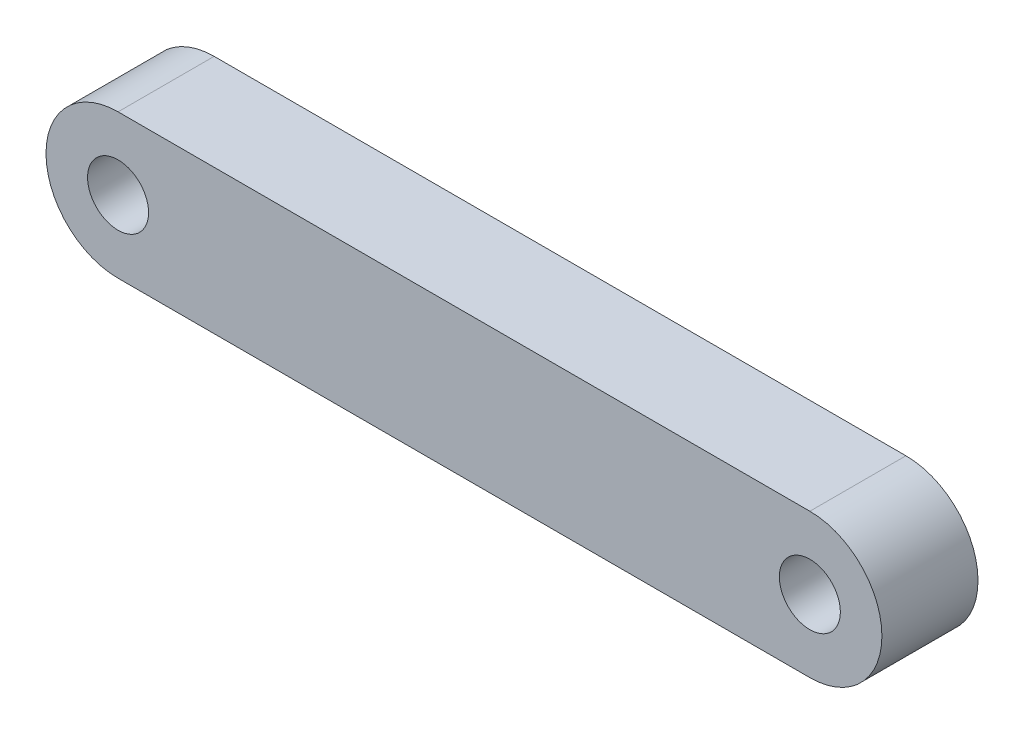
ISO-10303-21;
HEADER;
FILE_DESCRIPTION(('STEP AP214'),'2;1');
FILE_NAME('part.step','',(''),(''),'','','');
FILE_SCHEMA(('AUTOMOTIVE_DESIGN { 1 0 10303 214 1 1 1 1 }'));
ENDSEC;
DATA;
#1=APPLICATION_CONTEXT('core data for automotive mechanical design processes');
#2=APPLICATION_PROTOCOL_DEFINITION('international standard','automotive_design',2000,#1);
#3=PRODUCT_CONTEXT('',#1,'mechanical');
#4=PRODUCT('Part','Part','',(#3));
#5=PRODUCT_RELATED_PRODUCT_CATEGORY('part','',(#4));
#6=PRODUCT_DEFINITION_FORMATION('','',#4);
#7=PRODUCT_DEFINITION_CONTEXT('part definition',#1,'design');
#8=PRODUCT_DEFINITION('design','',#6,#7);
#9=PRODUCT_DEFINITION_SHAPE('','',#8);
#10=(LENGTH_UNIT() NAMED_UNIT(*) SI_UNIT(.MILLI.,.METRE.));
#11=(NAMED_UNIT(*) PLANE_ANGLE_UNIT() SI_UNIT($,.RADIAN.));
#12=(NAMED_UNIT(*) SI_UNIT($,.STERADIAN.) SOLID_ANGLE_UNIT());
#13=UNCERTAINTY_MEASURE_WITH_UNIT(LENGTH_MEASURE(1.E-05),#10,'distance_accuracy_value','');
#14=(GEOMETRIC_REPRESENTATION_CONTEXT(3) GLOBAL_UNCERTAINTY_ASSIGNED_CONTEXT((#13)) GLOBAL_UNIT_ASSIGNED_CONTEXT((#10,
#11,#12)) REPRESENTATION_CONTEXT('',''));
#15=CARTESIAN_POINT('',(0.,0.,0.));
#16=DIRECTION('',(0.,0.,1.));
#17=DIRECTION('',(1.,0.,0.));
#18=AXIS2_PLACEMENT_3D('',#15,#16,#17);
#19=CARTESIAN_POINT('',(-18.,0.,2.5));
#20=DIRECTION('',(0.,0.,-1.));
#21=DIRECTION('',(-1.,0.,0.));
#22=AXIS2_PLACEMENT_3D('',#19,#20,#21);
#23=CYLINDRICAL_SURFACE('',#22,3.75);
#24=CARTESIAN_POINT('',(-18.,0.,-2.5));
#25=DIRECTION('',(0.,0.,1.));
#26=DIRECTION('',(1.,0.,0.));
#27=AXIS2_PLACEMENT_3D('',#24,#25,#26);
#28=CIRCLE('',#27,3.75);
#29=CARTESIAN_POINT('',(-18.,3.75,-2.5));
#30=VERTEX_POINT('',#29);
#31=CARTESIAN_POINT('',(-18.,-3.75,-2.5));
#32=VERTEX_POINT('',#31);
#33=EDGE_CURVE('E97',#30,#32,#28,.T.);
#34=ORIENTED_EDGE('',*,*,#33,.T.);
#35=DIRECTION('',(0.,0.,-1.));
#36=VECTOR('',#35,1.);
#37=CARTESIAN_POINT('',(-18.,-3.75,2.5));
#38=LINE('',#37,#36);
#39=CARTESIAN_POINT('',(-18.,-3.75,2.5));
#40=VERTEX_POINT('',#39);
#41=EDGE_CURVE('E11',#40,#32,#38,.T.);
#42=ORIENTED_EDGE('',*,*,#41,.F.);
#43=CARTESIAN_POINT('',(-18.,0.,2.5));
#44=DIRECTION('',(0.,0.,1.));
#45=DIRECTION('',(1.,0.,0.));
#46=AXIS2_PLACEMENT_3D('',#43,#44,#45);
#47=CIRCLE('',#46,3.75);
#48=CARTESIAN_POINT('',(-18.,3.75,2.5));
#49=VERTEX_POINT('',#48);
#50=EDGE_CURVE('E85',#49,#40,#47,.T.);
#51=ORIENTED_EDGE('',*,*,#50,.F.);
#52=DIRECTION('',(0.,0.,-1.));
#53=VECTOR('',#52,1.);
#54=CARTESIAN_POINT('',(-18.,3.75,2.5));
#55=LINE('',#54,#53);
#56=EDGE_CURVE('E93',#49,#30,#55,.T.);
#57=ORIENTED_EDGE('',*,*,#56,.T.);
#58=EDGE_LOOP('',(#34,#42,#51,#57));
#59=FACE_BOUND('',#58,.T.);
#60=ADVANCED_FACE('F34',(#59),#23,.T.);
#61=CARTESIAN_POINT('',(-18.,-3.75,2.5));
#62=DIRECTION('',(0.,1.,0.));
#63=DIRECTION('',(0.,0.,1.));
#64=AXIS2_PLACEMENT_3D('',#61,#62,#63);
#65=PLANE('',#64);
#66=DIRECTION('',(1.,0.,0.));
#67=VECTOR('',#66,1.);
#68=CARTESIAN_POINT('',(-18.,-3.75,-2.5));
#69=LINE('',#68,#67);
#70=CARTESIAN_POINT('',(18.,-3.75,-2.5));
#71=VERTEX_POINT('',#70);
#72=EDGE_CURVE('E89',#32,#71,#69,.T.);
#73=ORIENTED_EDGE('',*,*,#72,.T.);
#74=DIRECTION('',(0.,0.,-1.));
#75=VECTOR('',#74,1.);
#76=CARTESIAN_POINT('',(18.,-3.75,2.5));
#77=LINE('',#76,#75);
#78=CARTESIAN_POINT('',(18.,-3.75,2.5));
#79=VERTEX_POINT('',#78);
#80=EDGE_CURVE('E42',#79,#71,#77,.T.);
#81=ORIENTED_EDGE('',*,*,#80,.F.);
#82=DIRECTION('',(1.,0.,0.));
#83=VECTOR('',#82,1.);
#84=CARTESIAN_POINT('',(-18.,-3.75,2.5));
#85=LINE('',#84,#83);
#86=EDGE_CURVE('E80',#40,#79,#85,.T.);
#87=ORIENTED_EDGE('',*,*,#86,.F.);
#88=ORIENTED_EDGE('',*,*,#41,.T.);
#89=EDGE_LOOP('',(#73,#81,#87,#88));
#90=FACE_BOUND('',#89,.T.);
#91=ADVANCED_FACE('F88',(#90),#65,.F.);
#92=CARTESIAN_POINT('',(18.,0.,2.5));
#93=DIRECTION('',(0.,0.,-1.));
#94=DIRECTION('',(-1.,0.,0.));
#95=AXIS2_PLACEMENT_3D('',#92,#93,#94);
#96=CYLINDRICAL_SURFACE('',#95,3.75);
#97=CARTESIAN_POINT('',(18.,0.,-2.5));
#98=DIRECTION('',(0.,0.,1.));
#99=DIRECTION('',(1.,0.,0.));
#100=AXIS2_PLACEMENT_3D('',#97,#98,#99);
#101=CIRCLE('',#100,3.75);
#102=CARTESIAN_POINT('',(18.,3.75000000000001,-2.5));
#103=VERTEX_POINT('',#102);
#104=EDGE_CURVE('E67',#71,#103,#101,.T.);
#105=ORIENTED_EDGE('',*,*,#104,.T.);
#106=DIRECTION('',(0.,0.,-1.));
#107=VECTOR('',#106,1.);
#108=CARTESIAN_POINT('',(18.,3.75000000000001,2.5));
#109=LINE('',#108,#107);
#110=CARTESIAN_POINT('',(18.,3.75000000000001,2.5));
#111=VERTEX_POINT('',#110);
#112=EDGE_CURVE('E90',#111,#103,#109,.T.);
#113=ORIENTED_EDGE('',*,*,#112,.F.);
#114=CARTESIAN_POINT('',(18.,0.,2.5));
#115=DIRECTION('',(0.,0.,1.));
#116=DIRECTION('',(1.,0.,0.));
#117=AXIS2_PLACEMENT_3D('',#114,#115,#116);
#118=CIRCLE('',#117,3.75);
#119=EDGE_CURVE('E83',#79,#111,#118,.T.);
#120=ORIENTED_EDGE('',*,*,#119,.F.);
#121=ORIENTED_EDGE('',*,*,#80,.T.);
#122=EDGE_LOOP('',(#105,#113,#120,#121));
#123=FACE_BOUND('',#122,.T.);
#124=ADVANCED_FACE('F91',(#123),#96,.T.);
#125=CARTESIAN_POINT('',(-18.,3.75,2.5));
#126=DIRECTION('',(0.,-1.,0.));
#127=DIRECTION('',(1.,0.,0.));
#128=AXIS2_PLACEMENT_3D('',#125,#126,#127);
#129=PLANE('',#128);
#130=DIRECTION('',(-1.,0.,0.));
#131=VECTOR('',#130,1.);
#132=CARTESIAN_POINT('',(-18.,3.75,-2.5));
#133=LINE('',#132,#131);
#134=EDGE_CURVE('E73',#103,#30,#133,.T.);
#135=ORIENTED_EDGE('',*,*,#134,.T.);
#136=ORIENTED_EDGE('',*,*,#56,.F.);
#137=DIRECTION('',(-1.,0.,0.));
#138=VECTOR('',#137,1.);
#139=CARTESIAN_POINT('',(-18.,3.75,2.5));
#140=LINE('',#139,#138);
#141=EDGE_CURVE('E50',#111,#49,#140,.T.);
#142=ORIENTED_EDGE('',*,*,#141,.F.);
#143=ORIENTED_EDGE('',*,*,#112,.T.);
#144=EDGE_LOOP('',(#135,#136,#142,#143));
#145=FACE_BOUND('',#144,.T.);
#146=ADVANCED_FACE('F105',(#145),#129,.F.);
#147=CARTESIAN_POINT('',(-18.,0.,2.5));
#148=DIRECTION('',(0.,0.,1.));
#149=DIRECTION('',(1.,0.,0.));
#150=AXIS2_PLACEMENT_3D('',#147,#148,#149);
#151=PLANE('',#150);
#152=CARTESIAN_POINT('',(-18.,0.,2.5));
#153=DIRECTION('',(0.,0.,1.));
#154=DIRECTION('',(1.,0.,0.));
#155=AXIS2_PLACEMENT_3D('',#152,#153,#154);
#156=CIRCLE('',#155,1.5875);
#157=CARTESIAN_POINT('',(-16.4125,0.,2.5));
#158=VERTEX_POINT('',#157);
#159=EDGE_CURVE('E117',#158,#158,#156,.T.);
#160=ORIENTED_EDGE('',*,*,#159,.F.);
#161=EDGE_LOOP('',(#160));
#162=FACE_BOUND('',#161,.T.);
#163=CARTESIAN_POINT('',(18.,0.,2.5));
#164=DIRECTION('',(0.,0.,1.));
#165=DIRECTION('',(1.,0.,0.));
#166=AXIS2_PLACEMENT_3D('',#163,#164,#165);
#167=CIRCLE('',#166,1.5875);
#168=CARTESIAN_POINT('',(19.5875,0.,2.5));
#169=VERTEX_POINT('',#168);
#170=EDGE_CURVE('E111',#169,#169,#167,.T.);
#171=ORIENTED_EDGE('',*,*,#170,.F.);
#172=EDGE_LOOP('',(#171));
#173=FACE_BOUND('',#172,.T.);
#174=ORIENTED_EDGE('',*,*,#50,.T.);
#175=ORIENTED_EDGE('',*,*,#86,.T.);
#176=ORIENTED_EDGE('',*,*,#119,.T.);
#177=ORIENTED_EDGE('',*,*,#141,.T.);
#178=EDGE_LOOP('',(#174,#175,#176,#177));
#179=FACE_BOUND('',#178,.T.);
#180=ADVANCED_FACE('F81',(#162,#173,#179),#151,.T.);
#181=CARTESIAN_POINT('',(-18.,0.,-2.5));
#182=DIRECTION('',(0.,0.,1.));
#183=DIRECTION('',(1.,0.,0.));
#184=AXIS2_PLACEMENT_3D('',#181,#182,#183);
#185=PLANE('',#184);
#186=CARTESIAN_POINT('',(-18.,0.,-2.5));
#187=DIRECTION('',(0.,0.,1.));
#188=DIRECTION('',(1.,0.,0.));
#189=AXIS2_PLACEMENT_3D('',#186,#187,#188);
#190=CIRCLE('',#189,1.5875);
#191=CARTESIAN_POINT('',(-16.4125,0.,-2.5));
#192=VERTEX_POINT('',#191);
#193=EDGE_CURVE('E100',#192,#192,#190,.T.);
#194=ORIENTED_EDGE('',*,*,#193,.T.);
#195=EDGE_LOOP('',(#194));
#196=FACE_BOUND('',#195,.T.);
#197=CARTESIAN_POINT('',(18.,0.,-2.5));
#198=DIRECTION('',(0.,0.,1.));
#199=DIRECTION('',(1.,0.,0.));
#200=AXIS2_PLACEMENT_3D('',#197,#198,#199);
#201=CIRCLE('',#200,1.5875);
#202=CARTESIAN_POINT('',(19.5875,0.,-2.5));
#203=VERTEX_POINT('',#202);
#204=EDGE_CURVE('E114',#203,#203,#201,.T.);
#205=ORIENTED_EDGE('',*,*,#204,.T.);
#206=EDGE_LOOP('',(#205));
#207=FACE_BOUND('',#206,.T.);
#208=ORIENTED_EDGE('',*,*,#33,.F.);
#209=ORIENTED_EDGE('',*,*,#134,.F.);
#210=ORIENTED_EDGE('',*,*,#104,.F.);
#211=ORIENTED_EDGE('',*,*,#72,.F.);
#212=EDGE_LOOP('',(#208,#209,#210,#211));
#213=FACE_BOUND('',#212,.T.);
#214=ADVANCED_FACE('F108',(#196,#207,#213),#185,.F.);
#215=CARTESIAN_POINT('',(18.,0.,-2.5));
#216=DIRECTION('',(0.,0.,1.));
#217=DIRECTION('',(1.,0.,0.));
#218=AXIS2_PLACEMENT_3D('',#215,#216,#217);
#219=CYLINDRICAL_SURFACE('',#218,1.5875);
#220=ORIENTED_EDGE('',*,*,#204,.F.);
#221=EDGE_LOOP('',(#220));
#222=FACE_BOUND('',#221,.T.);
#223=ORIENTED_EDGE('',*,*,#170,.T.);
#224=EDGE_LOOP('',(#223));
#225=FACE_BOUND('',#224,.T.);
#226=ADVANCED_FACE('F128',(#222,#225),#219,.F.);
#227=CARTESIAN_POINT('',(-18.,0.,-2.5));
#228=DIRECTION('',(0.,0.,1.));
#229=DIRECTION('',(1.,0.,0.));
#230=AXIS2_PLACEMENT_3D('',#227,#228,#229);
#231=CYLINDRICAL_SURFACE('',#230,1.5875);
#232=ORIENTED_EDGE('',*,*,#193,.F.);
#233=EDGE_LOOP('',(#232));
#234=FACE_BOUND('',#233,.T.);
#235=ORIENTED_EDGE('',*,*,#159,.T.);
#236=EDGE_LOOP('',(#235));
#237=FACE_BOUND('',#236,.T.);
#238=ADVANCED_FACE('F125',(#234,#237),#231,.F.);
#239=CLOSED_SHELL('',(#60,#91,#124,#146,#180,#214,#226,#238));
#240=MANIFOLD_SOLID_BREP('B2',#239);
#241=ADVANCED_BREP_SHAPE_REPRESENTATION('',(#18,#240),#14);
#242=SHAPE_DEFINITION_REPRESENTATION(#9,#241);
ENDSEC;
END-ISO-10303-21;
